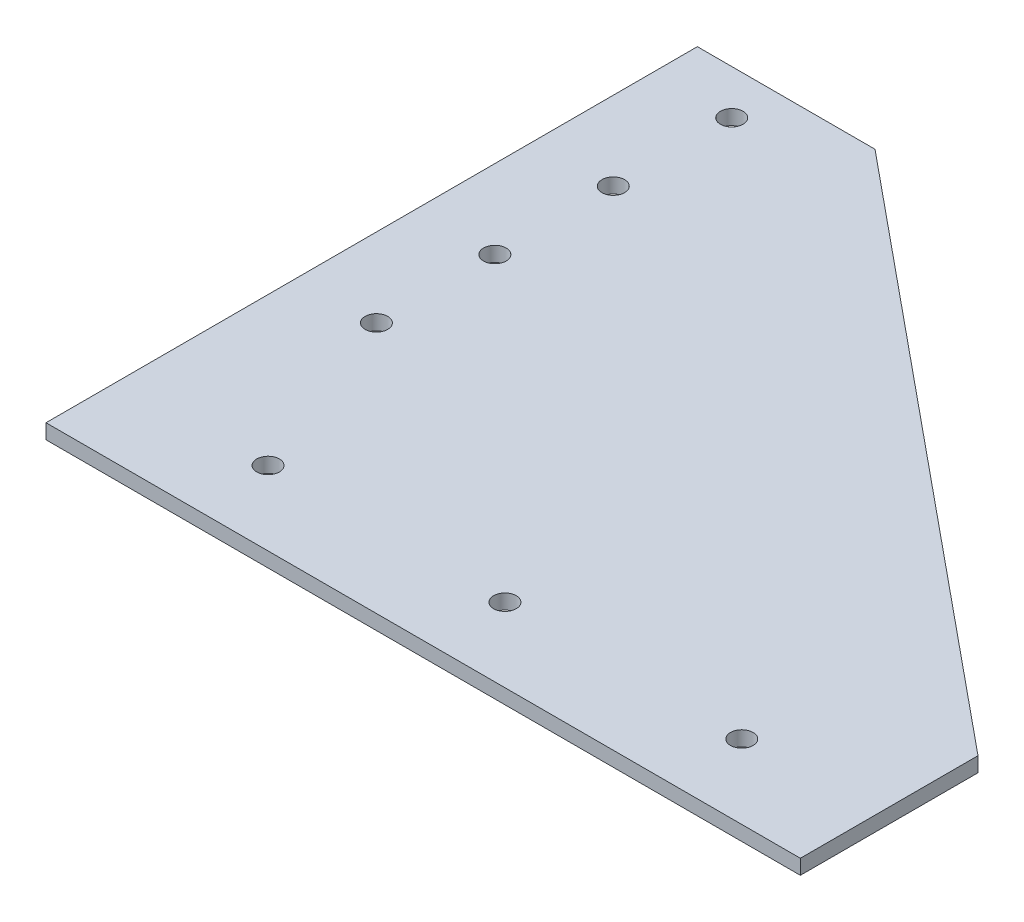
ISO-10303-21;
HEADER;
FILE_DESCRIPTION(('STEP AP214'),'2;1');
FILE_NAME('part.step','',(''),(''),'','','');
FILE_SCHEMA(('AUTOMOTIVE_DESIGN { 1 0 10303 214 1 1 1 1 }'));
ENDSEC;
DATA;
#1=APPLICATION_CONTEXT('core data for automotive mechanical design processes');
#2=APPLICATION_PROTOCOL_DEFINITION('international standard','automotive_design',2000,#1);
#3=PRODUCT_CONTEXT('',#1,'mechanical');
#4=PRODUCT('Part','Part','',(#3));
#5=PRODUCT_RELATED_PRODUCT_CATEGORY('part','',(#4));
#6=PRODUCT_DEFINITION_FORMATION('','',#4);
#7=PRODUCT_DEFINITION_CONTEXT('part definition',#1,'design');
#8=PRODUCT_DEFINITION('design','',#6,#7);
#9=PRODUCT_DEFINITION_SHAPE('','',#8);
#10=(LENGTH_UNIT() NAMED_UNIT(*) SI_UNIT(.MILLI.,.METRE.));
#11=(NAMED_UNIT(*) PLANE_ANGLE_UNIT() SI_UNIT($,.RADIAN.));
#12=(NAMED_UNIT(*) SI_UNIT($,.STERADIAN.) SOLID_ANGLE_UNIT());
#13=UNCERTAINTY_MEASURE_WITH_UNIT(LENGTH_MEASURE(1.E-05),#10,'distance_accuracy_value','');
#14=(GEOMETRIC_REPRESENTATION_CONTEXT(3) GLOBAL_UNCERTAINTY_ASSIGNED_CONTEXT((#13)) GLOBAL_UNIT_ASSIGNED_CONTEXT((#10,
#11,#12)) REPRESENTATION_CONTEXT('',''));
#15=CARTESIAN_POINT('',(0.,0.,0.));
#16=DIRECTION('',(0.,0.,1.));
#17=DIRECTION('',(1.,0.,0.));
#18=AXIS2_PLACEMENT_3D('',#15,#16,#17);
#19=CARTESIAN_POINT('',(0.,3.175,0.));
#20=DIRECTION('',(0.,1.,0.));
#21=DIRECTION('',(0.,0.,1.));
#22=AXIS2_PLACEMENT_3D('',#19,#20,#21);
#23=PLANE('',#22);
#24=CARTESIAN_POINT('',(16.8909999999998,3.175,-104.775));
#25=DIRECTION('',(0.,1.,0.));
#26=DIRECTION('',(0.,0.,1.));
#27=AXIS2_PLACEMENT_3D('',#24,#25,#26);
#28=CIRCLE('',#27,2.4257);
#29=CARTESIAN_POINT('',(16.8909999999998,3.175,-102.3493));
#30=VERTEX_POINT('',#29);
#31=EDGE_CURVE('E184',#30,#30,#28,.T.);
#32=ORIENTED_EDGE('',*,*,#31,.F.);
#33=EDGE_LOOP('',(#32));
#34=FACE_BOUND('',#33,.T.);
#35=CARTESIAN_POINT('',(133.35,3.175,-15.875));
#36=DIRECTION('',(0.,1.,0.));
#37=DIRECTION('',(0.,0.,1.));
#38=AXIS2_PLACEMENT_3D('',#35,#36,#37);
#39=CIRCLE('',#38,2.4257);
#40=CARTESIAN_POINT('',(133.35,3.175,-13.4493));
#41=VERTEX_POINT('',#40);
#42=EDGE_CURVE('E196',#41,#41,#39,.T.);
#43=ORIENTED_EDGE('',*,*,#42,.F.);
#44=EDGE_LOOP('',(#43));
#45=FACE_BOUND('',#44,.T.);
#46=CARTESIAN_POINT('',(16.891,3.175,-53.975));
#47=DIRECTION('',(0.,1.,0.));
#48=DIRECTION('',(0.,0.,1.));
#49=AXIS2_PLACEMENT_3D('',#46,#47,#48);
#50=CIRCLE('',#49,2.4257);
#51=CARTESIAN_POINT('',(16.891,3.175,-51.5493));
#52=VERTEX_POINT('',#51);
#53=EDGE_CURVE('E208',#52,#52,#50,.T.);
#54=ORIENTED_EDGE('',*,*,#53,.F.);
#55=EDGE_LOOP('',(#54));
#56=FACE_BOUND('',#55,.T.);
#57=DIRECTION('',(1.,0.,0.));
#58=VECTOR('',#57,1.);
#59=CARTESIAN_POINT('',(0.,3.175,0.));
#60=LINE('',#59,#58);
#61=CARTESIAN_POINT('',(0.,3.175,0.));
#62=VERTEX_POINT('',#61);
#63=CARTESIAN_POINT('',(161.78986433509,3.175,0.));
#64=VERTEX_POINT('',#63);
#65=EDGE_CURVE('E117',#62,#64,#60,.T.);
#66=ORIENTED_EDGE('',*,*,#65,.T.);
#67=DIRECTION('',(0.,0.,-1.));
#68=VECTOR('',#67,1.);
#69=CARTESIAN_POINT('',(161.78986433509,3.175,0.));
#70=LINE('',#69,#68);
#71=CARTESIAN_POINT('',(161.78986433509,3.175,-38.1));
#72=VERTEX_POINT('',#71);
#73=EDGE_CURVE('E84',#64,#72,#70,.T.);
#74=ORIENTED_EDGE('',*,*,#73,.T.);
#75=DIRECTION('',(-0.77273357349735,0.,-0.634730513202269));
#76=VECTOR('',#75,1.);
#77=CARTESIAN_POINT('',(38.1,3.175,-139.7));
#78=LINE('',#77,#76);
#79=CARTESIAN_POINT('',(38.1,3.175,-139.7));
#80=VERTEX_POINT('',#79);
#81=EDGE_CURVE('E88',#72,#80,#78,.T.);
#82=ORIENTED_EDGE('',*,*,#81,.T.);
#83=DIRECTION('',(-1.,0.,0.));
#84=VECTOR('',#83,1.);
#85=CARTESIAN_POINT('',(0.,3.175,-139.7));
#86=LINE('',#85,#84);
#87=CARTESIAN_POINT('',(0.,3.175,-139.7));
#88=VERTEX_POINT('',#87);
#89=EDGE_CURVE('E92',#80,#88,#86,.T.);
#90=ORIENTED_EDGE('',*,*,#89,.T.);
#91=DIRECTION('',(0.,0.,1.));
#92=VECTOR('',#91,1.);
#93=CARTESIAN_POINT('',(0.,3.175,0.));
#94=LINE('',#93,#92);
#95=EDGE_CURVE('E50',#88,#62,#94,.T.);
#96=ORIENTED_EDGE('',*,*,#95,.T.);
#97=EDGE_LOOP('',(#66,#74,#82,#90,#96));
#98=FACE_BOUND('',#97,.T.);
#99=CARTESIAN_POINT('',(31.75,3.175,-15.875));
#100=DIRECTION('',(0.,1.,0.));
#101=DIRECTION('',(0.,0.,1.));
#102=AXIS2_PLACEMENT_3D('',#99,#100,#101);
#103=CIRCLE('',#102,2.4257);
#104=CARTESIAN_POINT('',(31.75,3.175,-13.4493));
#105=VERTEX_POINT('',#104);
#106=EDGE_CURVE('E112',#105,#105,#103,.T.);
#107=ORIENTED_EDGE('',*,*,#106,.F.);
#108=EDGE_LOOP('',(#107));
#109=FACE_BOUND('',#108,.T.);
#110=CARTESIAN_POINT('',(82.55,3.175,-15.875));
#111=DIRECTION('',(0.,1.,0.));
#112=DIRECTION('',(0.,0.,1.));
#113=AXIS2_PLACEMENT_3D('',#110,#111,#112);
#114=CIRCLE('',#113,2.42570000000001);
#115=CARTESIAN_POINT('',(82.55,3.175,-13.4493));
#116=VERTEX_POINT('',#115);
#117=EDGE_CURVE('E202',#116,#116,#114,.T.);
#118=ORIENTED_EDGE('',*,*,#117,.F.);
#119=EDGE_LOOP('',(#118));
#120=FACE_BOUND('',#119,.T.);
#121=CARTESIAN_POINT('',(16.8909999999999,3.175,-79.375));
#122=DIRECTION('',(0.,1.,0.));
#123=DIRECTION('',(0.,0.,1.));
#124=AXIS2_PLACEMENT_3D('',#121,#122,#123);
#125=CIRCLE('',#124,2.4257);
#126=CARTESIAN_POINT('',(16.8909999999999,3.175,-76.9493));
#127=VERTEX_POINT('',#126);
#128=EDGE_CURVE('E190',#127,#127,#125,.T.);
#129=ORIENTED_EDGE('',*,*,#128,.F.);
#130=EDGE_LOOP('',(#129));
#131=FACE_BOUND('',#130,.T.);
#132=CARTESIAN_POINT('',(16.8909999999997,3.175,-130.175));
#133=DIRECTION('',(0.,1.,0.));
#134=DIRECTION('',(0.,0.,1.));
#135=AXIS2_PLACEMENT_3D('',#132,#133,#134);
#136=CIRCLE('',#135,2.4257);
#137=CARTESIAN_POINT('',(16.8909999999997,3.175,-127.7493));
#138=VERTEX_POINT('',#137);
#139=EDGE_CURVE('E175',#138,#138,#136,.T.);
#140=ORIENTED_EDGE('',*,*,#139,.F.);
#141=EDGE_LOOP('',(#140));
#142=FACE_BOUND('',#141,.T.);
#143=ADVANCED_FACE('F33',(#34,#45,#56,#98,#109,#120,#131,#142),#23,.T.);
#144=CARTESIAN_POINT('',(0.,0.,0.));
#145=DIRECTION('',(0.,1.,0.));
#146=DIRECTION('',(0.,0.,1.));
#147=AXIS2_PLACEMENT_3D('',#144,#145,#146);
#148=PLANE('',#147);
#149=DIRECTION('',(1.,0.,0.));
#150=VECTOR('',#149,1.);
#151=CARTESIAN_POINT('',(0.,0.,0.));
#152=LINE('',#151,#150);
#153=CARTESIAN_POINT('',(0.,0.,0.));
#154=VERTEX_POINT('',#153);
#155=CARTESIAN_POINT('',(161.78986433509,0.,0.));
#156=VERTEX_POINT('',#155);
#157=EDGE_CURVE('E108',#154,#156,#152,.T.);
#158=ORIENTED_EDGE('',*,*,#157,.F.);
#159=DIRECTION('',(0.,0.,1.));
#160=VECTOR('',#159,1.);
#161=CARTESIAN_POINT('',(0.,0.,0.));
#162=LINE('',#161,#160);
#163=CARTESIAN_POINT('',(0.,0.,-139.7));
#164=VERTEX_POINT('',#163);
#165=EDGE_CURVE('E76',#164,#154,#162,.T.);
#166=ORIENTED_EDGE('',*,*,#165,.F.);
#167=DIRECTION('',(-1.,0.,0.));
#168=VECTOR('',#167,1.);
#169=CARTESIAN_POINT('',(0.,0.,-139.7));
#170=LINE('',#169,#168);
#171=CARTESIAN_POINT('',(38.1,0.,-139.7));
#172=VERTEX_POINT('',#171);
#173=EDGE_CURVE('E70',#172,#164,#170,.T.);
#174=ORIENTED_EDGE('',*,*,#173,.F.);
#175=DIRECTION('',(-0.77273357349735,0.,-0.634730513202269));
#176=VECTOR('',#175,1.);
#177=CARTESIAN_POINT('',(38.1,0.,-139.7));
#178=LINE('',#177,#176);
#179=CARTESIAN_POINT('',(161.78986433509,0.,-38.1));
#180=VERTEX_POINT('',#179);
#181=EDGE_CURVE('E99',#180,#172,#178,.T.);
#182=ORIENTED_EDGE('',*,*,#181,.F.);
#183=DIRECTION('',(0.,0.,-1.));
#184=VECTOR('',#183,1.);
#185=CARTESIAN_POINT('',(161.78986433509,0.,0.));
#186=LINE('',#185,#184);
#187=EDGE_CURVE('E111',#156,#180,#186,.T.);
#188=ORIENTED_EDGE('',*,*,#187,.F.);
#189=EDGE_LOOP('',(#158,#166,#174,#182,#188));
#190=FACE_BOUND('',#189,.T.);
#191=CARTESIAN_POINT('',(31.75,0.,-15.875));
#192=DIRECTION('',(0.,1.,0.));
#193=DIRECTION('',(0.,0.,1.));
#194=AXIS2_PLACEMENT_3D('',#191,#192,#193);
#195=CIRCLE('',#194,2.4257);
#196=CARTESIAN_POINT('',(31.75,0.,-13.4493));
#197=VERTEX_POINT('',#196);
#198=EDGE_CURVE('E211',#197,#197,#195,.T.);
#199=ORIENTED_EDGE('',*,*,#198,.T.);
#200=EDGE_LOOP('',(#199));
#201=FACE_BOUND('',#200,.T.);
#202=CARTESIAN_POINT('',(16.891,0.,-53.975));
#203=DIRECTION('',(0.,1.,0.));
#204=DIRECTION('',(0.,0.,1.));
#205=AXIS2_PLACEMENT_3D('',#202,#203,#204);
#206=CIRCLE('',#205,2.4257);
#207=CARTESIAN_POINT('',(16.891,0.,-51.5493));
#208=VERTEX_POINT('',#207);
#209=EDGE_CURVE('E205',#208,#208,#206,.T.);
#210=ORIENTED_EDGE('',*,*,#209,.T.);
#211=EDGE_LOOP('',(#210));
#212=FACE_BOUND('',#211,.T.);
#213=CARTESIAN_POINT('',(82.55,0.,-15.875));
#214=DIRECTION('',(0.,1.,0.));
#215=DIRECTION('',(0.,0.,1.));
#216=AXIS2_PLACEMENT_3D('',#213,#214,#215);
#217=CIRCLE('',#216,2.42570000000001);
#218=CARTESIAN_POINT('',(82.55,0.,-13.4493));
#219=VERTEX_POINT('',#218);
#220=EDGE_CURVE('E199',#219,#219,#217,.T.);
#221=ORIENTED_EDGE('',*,*,#220,.T.);
#222=EDGE_LOOP('',(#221));
#223=FACE_BOUND('',#222,.T.);
#224=CARTESIAN_POINT('',(133.35,0.,-15.875));
#225=DIRECTION('',(0.,1.,0.));
#226=DIRECTION('',(0.,0.,1.));
#227=AXIS2_PLACEMENT_3D('',#224,#225,#226);
#228=CIRCLE('',#227,2.4257);
#229=CARTESIAN_POINT('',(133.35,0.,-13.4493));
#230=VERTEX_POINT('',#229);
#231=EDGE_CURVE('E193',#230,#230,#228,.T.);
#232=ORIENTED_EDGE('',*,*,#231,.T.);
#233=EDGE_LOOP('',(#232));
#234=FACE_BOUND('',#233,.T.);
#235=CARTESIAN_POINT('',(16.8909999999999,0.,-79.375));
#236=DIRECTION('',(0.,1.,0.));
#237=DIRECTION('',(0.,0.,1.));
#238=AXIS2_PLACEMENT_3D('',#235,#236,#237);
#239=CIRCLE('',#238,2.4257);
#240=CARTESIAN_POINT('',(16.8909999999999,0.,-76.9493));
#241=VERTEX_POINT('',#240);
#242=EDGE_CURVE('E187',#241,#241,#239,.T.);
#243=ORIENTED_EDGE('',*,*,#242,.T.);
#244=EDGE_LOOP('',(#243));
#245=FACE_BOUND('',#244,.T.);
#246=CARTESIAN_POINT('',(16.8909999999998,0.,-104.775));
#247=DIRECTION('',(0.,1.,0.));
#248=DIRECTION('',(0.,0.,1.));
#249=AXIS2_PLACEMENT_3D('',#246,#247,#248);
#250=CIRCLE('',#249,2.4257);
#251=CARTESIAN_POINT('',(16.8909999999998,0.,-102.3493));
#252=VERTEX_POINT('',#251);
#253=EDGE_CURVE('E181',#252,#252,#250,.T.);
#254=ORIENTED_EDGE('',*,*,#253,.T.);
#255=EDGE_LOOP('',(#254));
#256=FACE_BOUND('',#255,.T.);
#257=CARTESIAN_POINT('',(16.8909999999997,0.,-130.175));
#258=DIRECTION('',(0.,1.,0.));
#259=DIRECTION('',(0.,0.,1.));
#260=AXIS2_PLACEMENT_3D('',#257,#258,#259);
#261=CIRCLE('',#260,2.4257);
#262=CARTESIAN_POINT('',(16.8909999999997,0.,-127.7493));
#263=VERTEX_POINT('',#262);
#264=EDGE_CURVE('E178',#263,#263,#261,.T.);
#265=ORIENTED_EDGE('',*,*,#264,.T.);
#266=EDGE_LOOP('',(#265));
#267=FACE_BOUND('',#266,.T.);
#268=ADVANCED_FACE('F121',(#190,#201,#212,#223,#234,#245,#256,#267),#148,.F.);
#269=CARTESIAN_POINT('',(0.,3.175,0.));
#270=DIRECTION('',(0.,0.,-1.));
#271=DIRECTION('',(-1.,0.,0.));
#272=AXIS2_PLACEMENT_3D('',#269,#270,#271);
#273=PLANE('',#272);
#274=ORIENTED_EDGE('',*,*,#157,.T.);
#275=DIRECTION('',(0.,-1.,0.));
#276=VECTOR('',#275,1.);
#277=CARTESIAN_POINT('',(161.78986433509,3.175,0.));
#278=LINE('',#277,#276);
#279=EDGE_CURVE('E11',#64,#156,#278,.T.);
#280=ORIENTED_EDGE('',*,*,#279,.F.);
#281=ORIENTED_EDGE('',*,*,#65,.F.);
#282=DIRECTION('',(0.,-1.,0.));
#283=VECTOR('',#282,1.);
#284=CARTESIAN_POINT('',(0.,3.175,0.));
#285=LINE('',#284,#283);
#286=EDGE_CURVE('E104',#62,#154,#285,.T.);
#287=ORIENTED_EDGE('',*,*,#286,.T.);
#288=EDGE_LOOP('',(#274,#280,#281,#287));
#289=FACE_BOUND('',#288,.T.);
#290=ADVANCED_FACE('F35',(#289),#273,.F.);
#291=CARTESIAN_POINT('',(161.78986433509,3.175,0.));
#292=DIRECTION('',(-1.,0.,0.));
#293=DIRECTION('',(0.,0.,1.));
#294=AXIS2_PLACEMENT_3D('',#291,#292,#293);
#295=PLANE('',#294);
#296=ORIENTED_EDGE('',*,*,#187,.T.);
#297=DIRECTION('',(0.,-1.,0.));
#298=VECTOR('',#297,1.);
#299=CARTESIAN_POINT('',(161.78986433509,3.175,-38.1));
#300=LINE('',#299,#298);
#301=EDGE_CURVE('E42',#72,#180,#300,.T.);
#302=ORIENTED_EDGE('',*,*,#301,.F.);
#303=ORIENTED_EDGE('',*,*,#73,.F.);
#304=ORIENTED_EDGE('',*,*,#279,.T.);
#305=EDGE_LOOP('',(#296,#302,#303,#304));
#306=FACE_BOUND('',#305,.T.);
#307=ADVANCED_FACE('F287',(#306),#295,.F.);
#308=CARTESIAN_POINT('',(38.1,3.175,-139.7));
#309=DIRECTION('',(-0.634730513202269,0.,0.77273357349735));
#310=DIRECTION('',(0.77273357349735,0.,0.634730513202269));
#311=AXIS2_PLACEMENT_3D('',#308,#309,#310);
#312=PLANE('',#311);
#313=ORIENTED_EDGE('',*,*,#181,.T.);
#314=DIRECTION('',(0.,-1.,0.));
#315=VECTOR('',#314,1.);
#316=CARTESIAN_POINT('',(38.1,3.175,-139.7));
#317=LINE('',#316,#315);
#318=EDGE_CURVE('E96',#80,#172,#317,.T.);
#319=ORIENTED_EDGE('',*,*,#318,.F.);
#320=ORIENTED_EDGE('',*,*,#81,.F.);
#321=ORIENTED_EDGE('',*,*,#301,.T.);
#322=EDGE_LOOP('',(#313,#319,#320,#321));
#323=FACE_BOUND('',#322,.T.);
#324=ADVANCED_FACE('F97',(#323),#312,.F.);
#325=CARTESIAN_POINT('',(0.,3.175,-139.7));
#326=DIRECTION('',(0.,0.,1.));
#327=DIRECTION('',(1.,0.,0.));
#328=AXIS2_PLACEMENT_3D('',#325,#326,#327);
#329=PLANE('',#328);
#330=ORIENTED_EDGE('',*,*,#173,.T.);
#331=DIRECTION('',(0.,-1.,0.));
#332=VECTOR('',#331,1.);
#333=CARTESIAN_POINT('',(0.,3.175,-139.7));
#334=LINE('',#333,#332);
#335=EDGE_CURVE('E100',#88,#164,#334,.T.);
#336=ORIENTED_EDGE('',*,*,#335,.F.);
#337=ORIENTED_EDGE('',*,*,#89,.F.);
#338=ORIENTED_EDGE('',*,*,#318,.T.);
#339=EDGE_LOOP('',(#330,#336,#337,#338));
#340=FACE_BOUND('',#339,.T.);
#341=ADVANCED_FACE('F102',(#340),#329,.F.);
#342=CARTESIAN_POINT('',(0.,3.175,0.));
#343=DIRECTION('',(1.,0.,0.));
#344=DIRECTION('',(0.,0.,-1.));
#345=AXIS2_PLACEMENT_3D('',#342,#343,#344);
#346=PLANE('',#345);
#347=ORIENTED_EDGE('',*,*,#165,.T.);
#348=ORIENTED_EDGE('',*,*,#286,.F.);
#349=ORIENTED_EDGE('',*,*,#95,.F.);
#350=ORIENTED_EDGE('',*,*,#335,.T.);
#351=EDGE_LOOP('',(#347,#348,#349,#350));
#352=FACE_BOUND('',#351,.T.);
#353=ADVANCED_FACE('F126',(#352),#346,.F.);
#354=CARTESIAN_POINT('',(31.75,3.175,-15.875));
#355=DIRECTION('',(0.,-1.,0.));
#356=DIRECTION('',(0.,0.,-1.));
#357=AXIS2_PLACEMENT_3D('',#354,#355,#356);
#358=CYLINDRICAL_SURFACE('',#357,2.4257);
#359=ORIENTED_EDGE('',*,*,#106,.T.);
#360=EDGE_LOOP('',(#359));
#361=FACE_BOUND('',#360,.T.);
#362=ORIENTED_EDGE('',*,*,#198,.F.);
#363=EDGE_LOOP('',(#362));
#364=FACE_BOUND('',#363,.T.);
#365=ADVANCED_FACE('F128',(#361,#364),#358,.F.);
#366=CARTESIAN_POINT('',(16.891,3.175,-53.975));
#367=DIRECTION('',(0.,-1.,0.));
#368=DIRECTION('',(0.,0.,-1.));
#369=AXIS2_PLACEMENT_3D('',#366,#367,#368);
#370=CYLINDRICAL_SURFACE('',#369,2.4257);
#371=ORIENTED_EDGE('',*,*,#53,.T.);
#372=EDGE_LOOP('',(#371));
#373=FACE_BOUND('',#372,.T.);
#374=ORIENTED_EDGE('',*,*,#209,.F.);
#375=EDGE_LOOP('',(#374));
#376=FACE_BOUND('',#375,.T.);
#377=ADVANCED_FACE('F134',(#373,#376),#370,.F.);
#378=CARTESIAN_POINT('',(82.55,3.175,-15.875));
#379=DIRECTION('',(0.,-1.,0.));
#380=DIRECTION('',(0.,0.,-1.));
#381=AXIS2_PLACEMENT_3D('',#378,#379,#380);
#382=CYLINDRICAL_SURFACE('',#381,2.42570000000001);
#383=ORIENTED_EDGE('',*,*,#117,.T.);
#384=EDGE_LOOP('',(#383));
#385=FACE_BOUND('',#384,.T.);
#386=ORIENTED_EDGE('',*,*,#220,.F.);
#387=EDGE_LOOP('',(#386));
#388=FACE_BOUND('',#387,.T.);
#389=ADVANCED_FACE('F150',(#385,#388),#382,.F.);
#390=CARTESIAN_POINT('',(133.35,3.175,-15.875));
#391=DIRECTION('',(0.,-1.,0.));
#392=DIRECTION('',(0.,0.,-1.));
#393=AXIS2_PLACEMENT_3D('',#390,#391,#392);
#394=CYLINDRICAL_SURFACE('',#393,2.4257);
#395=ORIENTED_EDGE('',*,*,#42,.T.);
#396=EDGE_LOOP('',(#395));
#397=FACE_BOUND('',#396,.T.);
#398=ORIENTED_EDGE('',*,*,#231,.F.);
#399=EDGE_LOOP('',(#398));
#400=FACE_BOUND('',#399,.T.);
#401=ADVANCED_FACE('F154',(#397,#400),#394,.F.);
#402=CARTESIAN_POINT('',(16.8909999999999,3.175,-79.375));
#403=DIRECTION('',(0.,-1.,0.));
#404=DIRECTION('',(0.,0.,-1.));
#405=AXIS2_PLACEMENT_3D('',#402,#403,#404);
#406=CYLINDRICAL_SURFACE('',#405,2.4257);
#407=ORIENTED_EDGE('',*,*,#128,.T.);
#408=EDGE_LOOP('',(#407));
#409=FACE_BOUND('',#408,.T.);
#410=ORIENTED_EDGE('',*,*,#242,.F.);
#411=EDGE_LOOP('',(#410));
#412=FACE_BOUND('',#411,.T.);
#413=ADVANCED_FACE('F158',(#409,#412),#406,.F.);
#414=CARTESIAN_POINT('',(16.8909999999998,3.175,-104.775));
#415=DIRECTION('',(0.,-1.,0.));
#416=DIRECTION('',(0.,0.,-1.));
#417=AXIS2_PLACEMENT_3D('',#414,#415,#416);
#418=CYLINDRICAL_SURFACE('',#417,2.4257);
#419=ORIENTED_EDGE('',*,*,#31,.T.);
#420=EDGE_LOOP('',(#419));
#421=FACE_BOUND('',#420,.T.);
#422=ORIENTED_EDGE('',*,*,#253,.F.);
#423=EDGE_LOOP('',(#422));
#424=FACE_BOUND('',#423,.T.);
#425=ADVANCED_FACE('F162',(#421,#424),#418,.F.);
#426=CARTESIAN_POINT('',(16.8909999999997,3.175,-130.175));
#427=DIRECTION('',(0.,-1.,0.));
#428=DIRECTION('',(0.,0.,-1.));
#429=AXIS2_PLACEMENT_3D('',#426,#427,#428);
#430=CYLINDRICAL_SURFACE('',#429,2.4257);
#431=ORIENTED_EDGE('',*,*,#139,.T.);
#432=EDGE_LOOP('',(#431));
#433=FACE_BOUND('',#432,.T.);
#434=ORIENTED_EDGE('',*,*,#264,.F.);
#435=EDGE_LOOP('',(#434));
#436=FACE_BOUND('',#435,.T.);
#437=ADVANCED_FACE('F166',(#433,#436),#430,.F.);
#438=CLOSED_SHELL('',(#143,#268,#290,#307,#324,#341,#353,#365,#377,#389,#401,#413,#425,#437));
#439=MANIFOLD_SOLID_BREP('B2',#438);
#440=ADVANCED_BREP_SHAPE_REPRESENTATION('',(#18,#439),#14);
#441=SHAPE_DEFINITION_REPRESENTATION(#9,#440);
ENDSEC;
END-ISO-10303-21;
